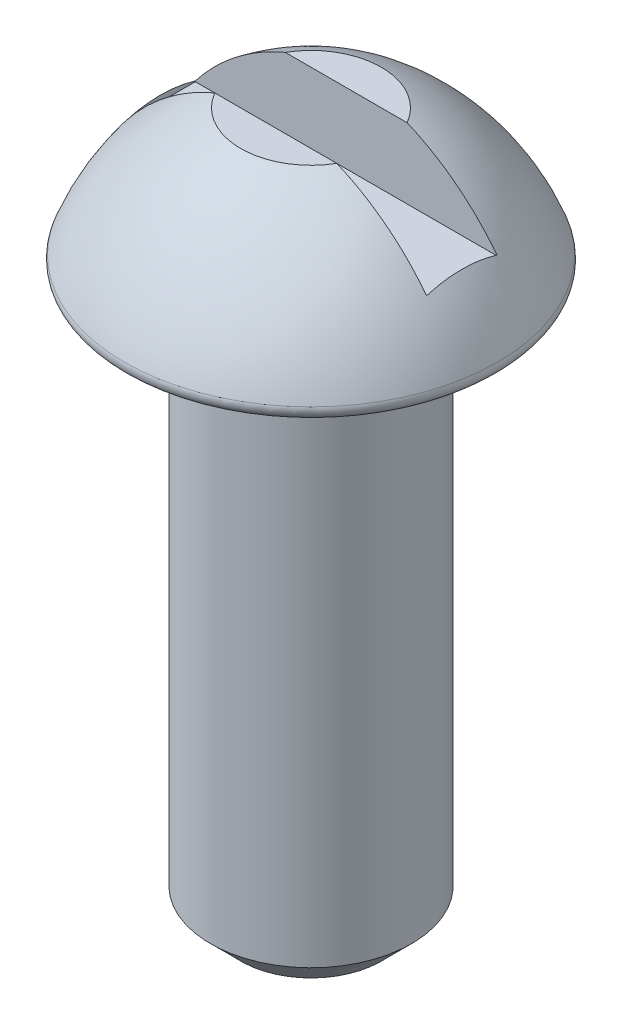
ISO-10303-21;
HEADER;
FILE_DESCRIPTION(('STEP AP214'),'2;1');
FILE_NAME('part.step','',(''),(''),'','','');
FILE_SCHEMA(('AUTOMOTIVE_DESIGN { 1 0 10303 214 1 1 1 1 }'));
ENDSEC;
DATA;
#1=APPLICATION_CONTEXT('core data for automotive mechanical design processes');
#2=APPLICATION_PROTOCOL_DEFINITION('international standard','automotive_design',2000,#1);
#3=PRODUCT_CONTEXT('',#1,'mechanical');
#4=PRODUCT('Part','Part','',(#3));
#5=PRODUCT_RELATED_PRODUCT_CATEGORY('part','',(#4));
#6=PRODUCT_DEFINITION_FORMATION('','',#4);
#7=PRODUCT_DEFINITION_CONTEXT('part definition',#1,'design');
#8=PRODUCT_DEFINITION('design','',#6,#7);
#9=PRODUCT_DEFINITION_SHAPE('','',#8);
#10=(LENGTH_UNIT() NAMED_UNIT(*) SI_UNIT(.MILLI.,.METRE.));
#11=(NAMED_UNIT(*) PLANE_ANGLE_UNIT() SI_UNIT($,.RADIAN.));
#12=(NAMED_UNIT(*) SI_UNIT($,.STERADIAN.) SOLID_ANGLE_UNIT());
#13=UNCERTAINTY_MEASURE_WITH_UNIT(LENGTH_MEASURE(1.E-05),#10,'distance_accuracy_value','');
#14=(GEOMETRIC_REPRESENTATION_CONTEXT(3) GLOBAL_UNCERTAINTY_ASSIGNED_CONTEXT((#13)) GLOBAL_UNIT_ASSIGNED_CONTEXT((#10,
#11,#12)) REPRESENTATION_CONTEXT('',''));
#15=CARTESIAN_POINT('',(0.,0.,0.));
#16=DIRECTION('',(0.,0.,1.));
#17=DIRECTION('',(1.,0.,0.));
#18=AXIS2_PLACEMENT_3D('',#15,#16,#17);
#19=CARTESIAN_POINT('',(0.,7.,0.));
#20=DIRECTION('',(0.,1.,0.));
#21=DIRECTION('',(0.,0.,1.));
#22=AXIS2_PLACEMENT_3D('',#19,#20,#21);
#23=PLANE('',#22);
#24=DIRECTION('',(-1.,0.,0.));
#25=VECTOR('',#24,1.);
#26=CARTESIAN_POINT('',(-1.5,7.,-0.35));
#27=LINE('',#26,#25);
#28=CARTESIAN_POINT('',(0.606217782649106,7.,-0.35));
#29=VERTEX_POINT('',#28);
#30=CARTESIAN_POINT('',(-0.606217782649106,7.,-0.35));
#31=VERTEX_POINT('',#30);
#32=EDGE_CURVE('E105',#29,#31,#27,.T.);
#33=ORIENTED_EDGE('',*,*,#32,.F.);
#34=CARTESIAN_POINT('',(0.,7.,0.));
#35=DIRECTION('',(0.,-1.,0.));
#36=DIRECTION('',(0.,0.,-1.));
#37=AXIS2_PLACEMENT_3D('',#34,#35,#36);
#38=CIRCLE('',#37,0.7);
#39=EDGE_CURVE('E128',#31,#29,#38,.T.);
#40=ORIENTED_EDGE('',*,*,#39,.F.);
#41=EDGE_LOOP('',(#33,#40));
#42=FACE_BOUND('',#41,.T.);
#43=ADVANCED_FACE('F29',(#42),#23,.T.);
#44=CARTESIAN_POINT('',(0.7,0.,0.));
#45=DIRECTION('',(0.,-1.,0.));
#46=DIRECTION('',(0.,0.,-1.));
#47=AXIS2_PLACEMENT_3D('',#44,#45,#46);
#48=PLANE('',#47);
#49=CARTESIAN_POINT('',(0.,0.,0.));
#50=DIRECTION('',(0.,-1.,0.));
#51=DIRECTION('',(0.,0.,-1.));
#52=AXIS2_PLACEMENT_3D('',#49,#50,#51);
#53=CIRCLE('',#52,0.7);
#54=CARTESIAN_POINT('',(0.,0.,-0.7));
#55=VERTEX_POINT('',#54);
#56=EDGE_CURVE('E115',#55,#55,#53,.T.);
#57=ORIENTED_EDGE('',*,*,#56,.T.);
#58=EDGE_LOOP('',(#57));
#59=FACE_BOUND('',#58,.T.);
#60=ADVANCED_FACE('F31',(#59),#48,.T.);
#61=DIRECTION('',(1.,0.,0.));
#62=VECTOR('',#61,1.);
#63=CARTESIAN_POINT('',(-1.5,7.,0.35));
#64=LINE('',#63,#62);
#65=CARTESIAN_POINT('',(-0.606217782649106,7.,0.35));
#66=VERTEX_POINT('',#65);
#67=CARTESIAN_POINT('',(0.606217782649106,7.,0.35));
#68=VERTEX_POINT('',#67);
#69=EDGE_CURVE('E107',#66,#68,#64,.T.);
#70=ORIENTED_EDGE('',*,*,#69,.F.);
#71=EDGE_CURVE('E131',#68,#66,#38,.T.);
#72=ORIENTED_EDGE('',*,*,#71,.F.);
#73=EDGE_LOOP('',(#70,#72));
#74=FACE_BOUND('',#73,.T.);
#75=ADVANCED_FACE('F176',(#74),#23,.T.);
#76=CARTESIAN_POINT('',(0.,4.92256290284434,0.));
#77=DIRECTION('',(0.,-1.,0.));
#78=DIRECTION('',(0.,0.,-1.));
#79=AXIS2_PLACEMENT_3D('',#76,#77,#78);
#80=DEGENERATE_TOROIDAL_SURFACE('',#79,0.30700994668161,2.30863897683338,.F.);
#81=CARTESIAN_POINT('',(0.,7.13573977225981,-0.35));
#82=CARTESIAN_POINT('',(-0.0301024352128601,7.1357409907999,-0.35));
#83=CARTESIAN_POINT('',(-0.0602037065858999,7.13457737456034,-0.35));
#84=CARTESIAN_POINT('',(-0.120237464629894,7.13004476709693,-0.35));
#85=CARTESIAN_POINT('',(-0.150169923687119,7.12667542505043,-0.35));
#86=CARTESIAN_POINT('',(-0.239755636779077,7.11364003954532,-0.35));
#87=CARTESIAN_POINT('',(-0.29898894542948,7.10104982862452,-0.35));
#88=CARTESIAN_POINT('',(-0.4107220201702,7.07124883148929,-0.35));
#89=CARTESIAN_POINT('',(-0.463360105723818,7.0545337272663,-0.35));
#90=CARTESIAN_POINT('',(-0.567078580438325,7.01677768390689,-0.35));
#91=CARTESIAN_POINT('',(-0.618158166080245,6.99573455523669,-0.35));
#92=CARTESIAN_POINT('',(-0.768700695331825,6.92668912362428,-0.35));
#93=CARTESIAN_POINT('',(-0.865504105738005,6.87276045607374,-0.35));
#94=CARTESIAN_POINT('',(-1.05381770511512,6.74855258072186,-0.35));
#95=CARTESIAN_POINT('',(-1.14493451427674,6.67768151341926,-0.35));
#96=CARTESIAN_POINT('',(-1.31520585423532,6.5228692332829,-0.35));
#97=CARTESIAN_POINT('',(-1.39436581290114,6.43893398634478,-0.35));
#98=CARTESIAN_POINT('',(-1.5458587899203,6.25150386434966,-0.35));
#99=CARTESIAN_POINT('',(-1.61683638715699,6.14690960003854,-0.35));
#100=CARTESIAN_POINT('',(-1.74048477136378,5.9273513028306,-0.35));
#101=CARTESIAN_POINT('',(-1.79314587012967,5.81238182250396,-0.35));
#102=CARTESIAN_POINT('',(-1.87917651162118,5.57395439700353,-0.35));
#103=CARTESIAN_POINT('',(-1.91232042380521,5.45041495071043,-0.35));
#104=CARTESIAN_POINT('',(-1.95744743808432,5.19955872286589,-0.35));
#105=CARTESIAN_POINT('',(-1.9694348144659,5.07224270958615,-0.35));
#106=CARTESIAN_POINT('',(-1.97193309925212,4.81708719715164,-0.35));
#107=CARTESIAN_POINT('',(-1.96239143952019,4.6892471791102,-0.35));
#108=CARTESIAN_POINT('',(-1.92197991496443,4.43692504523293,-0.35));
#109=CARTESIAN_POINT('',(-1.89110056432445,4.31244444843431,-0.35));
#110=CARTESIAN_POINT('',(-1.80884392511569,4.07036655976084,-0.35));
#111=CARTESIAN_POINT('',(-1.75745428138543,3.95277346588935,-0.35));
#112=CARTESIAN_POINT('',(-1.63569213592404,3.72806771696485,-0.35));
#113=CARTESIAN_POINT('',(-1.56534615403697,3.62094070305138,-0.35));
#114=CARTESIAN_POINT('',(-1.40788549136369,3.42042796844041,-0.35));
#115=CARTESIAN_POINT('',(-1.32082850128929,3.32699686840395,-0.35));
#116=CARTESIAN_POINT('',(-1.13169955336796,3.15579882780109,-0.35));
#117=CARTESIAN_POINT('',(-1.02956695382156,3.07809830586138,-0.35));
#118=CARTESIAN_POINT('',(-0.867954840857822,2.97596834442508,-0.35));
#119=CARTESIAN_POINT('',(-0.812867875261867,2.94440520962073,-0.35));
#120=CARTESIAN_POINT('',(-0.700072885190367,2.88623855042426,-0.35));
#121=CARTESIAN_POINT('',(-0.642363567822303,2.85963750621013,-0.35));
#122=CARTESIAN_POINT('',(-0.525137072964046,2.81206247407257,-0.35));
#123=CARTESIAN_POINT('',(-0.465635245674405,2.79105066689571,-0.35));
#124=CARTESIAN_POINT('',(-0.344796976922579,2.75519828705325,-0.35));
#125=CARTESIAN_POINT('',(-0.283462170275168,2.74035238137611,-0.35));
#126=CARTESIAN_POINT('',(-0.182837497701831,2.72267504478291,-0.35));
#127=CARTESIAN_POINT('',(-0.143975000741483,2.71742349587871,-0.35));
#128=CARTESIAN_POINT('',(-0.0659472153998688,2.71060851468356,-0.35));
#129=CARTESIAN_POINT('',(-0.0267822634587777,2.709041449989,-0.35));
#130=CARTESIAN_POINT('',(0.0514996994513468,2.70986014915738,-0.35));
#131=CARTESIAN_POINT('',(0.0906167147447711,2.71224552543082,-0.35));
#132=CARTESIAN_POINT('',(0.168489516968755,2.72057120365083,-0.35));
#133=CARTESIAN_POINT('',(0.207244913460364,2.72651497794714,-0.35));
#134=CARTESIAN_POINT('',(0.297186983275777,2.74385667146756,-0.35));
#135=CARTESIAN_POINT('',(0.348147444927707,2.75641909406697,-0.35));
#136=CARTESIAN_POINT('',(0.448782130756164,2.78585305100436,-0.35));
#137=CARTESIAN_POINT('',(0.498456106193271,2.80272541190968,-0.35));
#138=CARTESIAN_POINT('',(0.645691735122621,2.85920364103099,-0.35));
#139=CARTESIAN_POINT('',(0.741086931735451,2.90458897505198,-0.35));
#140=CARTESIAN_POINT('',(0.926914711477642,3.01006939168425,-0.35));
#141=CARTESIAN_POINT('',(1.01712639940075,3.07054913552739,-0.35));
#142=CARTESIAN_POINT('',(1.18761541773933,3.20377154084975,-0.35));
#143=CARTESIAN_POINT('',(1.26791683452433,3.27648341302051,-0.35));
#144=CARTESIAN_POINT('',(1.42898606712891,3.44492874445312,-0.35));
#145=CARTESIAN_POINT('',(1.50785880157877,3.54248421849531,-0.35));
#146=CARTESIAN_POINT('',(1.64853351430612,3.74939447232945,-0.35));
#147=CARTESIAN_POINT('',(1.71031058090735,3.85876615151073,-0.35));
#148=CARTESIAN_POINT('',(1.81587916059814,4.08809092488977,-0.35));
#149=CARTESIAN_POINT('',(1.85935475794216,4.20818964733825,-0.35));
#150=CARTESIAN_POINT('',(1.92559076522618,4.4539162328496,-0.35));
#151=CARTESIAN_POINT('',(1.94835898429007,4.57954199281432,-0.35));
#152=CARTESIAN_POINT('',(1.97262656380435,4.83332204735555,-0.35));
#153=CARTESIAN_POINT('',(1.97404368969975,4.96148421557371,-0.35));
#154=CARTESIAN_POINT('',(1.95535530532741,5.21625193900725,-0.35));
#155=CARTESIAN_POINT('',(1.9352459718645,5.34285721367134,-0.35));
#156=CARTESIAN_POINT('',(1.8740414996424,5.59097434174327,-0.35));
#157=CARTESIAN_POINT('',(1.83293334362505,5.71248298510889,-0.35));
#158=CARTESIAN_POINT('',(1.73088669666713,5.94683264971115,-0.35));
#159=CARTESIAN_POINT('',(1.66995287582174,6.0596757044672,-0.35));
#160=CARTESIAN_POINT('',(1.53005046998841,6.27333261748544,-0.35));
#161=CARTESIAN_POINT('',(1.45110918047703,6.37416433381029,-0.35));
#162=CARTESIAN_POINT('',(1.27729409761747,6.56109854555075,-0.35));
#163=CARTESIAN_POINT('',(1.18241077455344,6.64719216841669,-0.35));
#164=CARTESIAN_POINT('',(0.979876940738833,6.80150053722627,-0.35));
#165=CARTESIAN_POINT('',(0.872308436433896,6.86982186068413,-0.35));
#166=CARTESIAN_POINT('',(0.703337919829298,6.95732153569163,-0.35));
#167=CARTESIAN_POINT('',(0.645714301815414,6.98400055571077,-0.35));
#168=CARTESIAN_POINT('',(0.528241861947786,7.03192416058878,-0.35));
#169=CARTESIAN_POINT('',(0.468394366795807,7.05317192780429,-0.35));
#170=CARTESIAN_POINT('',(0.374465982094127,7.0811684898228,-0.35));
#171=CARTESIAN_POINT('',(0.341030799034512,7.09011893346942,-0.35));
#172=CARTESIAN_POINT('',(0.273662343838694,7.10591092919828,-0.35));
#173=CARTESIAN_POINT('',(0.239729147195218,7.11275279752508,-0.35));
#174=CARTESIAN_POINT('',(0.171615827365619,7.12395218909176,-0.35));
#175=CARTESIAN_POINT('',(0.137437694740271,7.12832157851761,-0.35));
#176=CARTESIAN_POINT('',(0.0688391385061037,7.13421415114043,-0.35));
#177=CARTESIAN_POINT('',(0.0344188084861329,7.13573837899386,-0.35));
#178=CARTESIAN_POINT('',(0.,7.13573977225981,-0.35));
#179=B_SPLINE_CURVE_WITH_KNOTS('',3,(#81,#82,#83,#84,#85,#86,#87,#88,#89,#90,#91,#92,#93,#94,
#95,#96,#97,#98,#99,#100,#101,#102,#103,#104,#105,#106,#107,#108,#109,#110,#111,#112,#113,#114,
#115,#116,#117,#118,#119,#120,#121,#122,#123,#124,#125,#126,#127,#128,#129,#130,#131,#132,#133,
#134,#135,#136,#137,#138,#139,#140,#141,#142,#143,#144,#145,#146,#147,#148,#149,#150,#151,#152,
#153,#154,#155,#156,#157,#158,#159,#160,#161,#162,#163,#164,#165,#166,#167,#168,#169,#170,#171,
#172,#173,#174,#175,#176,#177,#178),.UNSPECIFIED.,.T.,.F.,(4,2,2,2,2,2,2,2,2,2,2,2,2,2,2,2,2,2,
2,2,2,2,2,2,2,2,2,2,2,2,2,2,2,2,2,2,2,2,2,2,2,2,2,2,2,2,2,2,4),(0.,0.0902833208739151,
0.180581004879809,0.361796063276473,0.527288087985619,0.692864041427401,1.02390289255828,
1.36885285309954,1.71364574828677,2.0910746667025,2.46870291729688,2.85061517384456,
3.23245026325271,3.61521870029255,3.99815740922052,4.38132714497276,4.76396358598733,
5.145302081863,5.52821856826565,5.71848612033824,5.90884851959201,6.09788804105489,
6.28676371623324,6.40427084256284,6.5216620740792,6.63904179450269,6.75653624332486,
6.91374732931968,7.07098858819111,7.38662454837917,7.71131599850878,8.0352020769111,
8.40979352951631,8.78492799356518,9.16629591030332,9.54751994664993,9.93021190828653,
10.3129718490002,10.6959693526722,11.0788767034316,11.4612074604209,11.8437675828505,
12.2239777193922,12.4142717245481,12.6044539730276,12.708238810703,12.812008075123,
12.9152750005792,13.0185040021094),.UNSPECIFIED.);
#180=CARTESIAN_POINT('',(1.5,6.30722487525319,-0.35));
#181=VERTEX_POINT('',#180);
#182=EDGE_CURVE('E11',#181,#29,#179,.T.);
#183=ORIENTED_EDGE('',*,*,#182,.F.);
#184=CARTESIAN_POINT('',(1.5,6.35940979028503,0.));
#185=CARTESIAN_POINT('',(1.5,6.35940117527301,-0.0789068754106214));
#186=CARTESIAN_POINT('',(1.5,6.35151559324378,-0.157939355680734));
#187=CARTESIAN_POINT('',(1.5,6.3204761977011,-0.313038755257547));
#188=CARTESIAN_POINT('',(1.5,6.29728887849217,-0.389098777871058));
#189=CARTESIAN_POINT('',(1.5,6.24126859806856,-0.525400075486103));
#190=CARTESIAN_POINT('',(1.5,6.21020176452969,-0.586377951264508));
#191=CARTESIAN_POINT('',(1.5,6.13903627072882,-0.702733899656246));
#192=CARTESIAN_POINT('',(1.5,6.09894355200281,-0.758115621500189));
#193=CARTESIAN_POINT('',(1.5,6.00741215615635,-0.866522430703714));
#194=CARTESIAN_POINT('',(1.5,5.95531744432904,-0.918993130106391));
#195=CARTESIAN_POINT('',(1.5,5.84363554439566,-1.01525351273952));
#196=CARTESIAN_POINT('',(1.5,5.78404453276471,-1.0590387363215));
#197=CARTESIAN_POINT('',(1.5,5.65390214417337,-1.14030196999279));
#198=CARTESIAN_POINT('',(1.5,5.5828543819259,-1.17698613895365));
#199=CARTESIAN_POINT('',(1.5,5.43583340388057,-1.23859568647142));
#200=CARTESIAN_POINT('',(1.5,5.35985891849232,-1.26351802025982));
#201=CARTESIAN_POINT('',(1.5,5.20081830526798,-1.30213580286138));
#202=CARTESIAN_POINT('',(1.5,5.11758981678659,-1.31516501550607));
#203=CARTESIAN_POINT('',(1.5,4.95011896880228,-1.3273951363592));
#204=CARTESIAN_POINT('',(1.5,4.86587645289109,-1.32659388325657));
#205=CARTESIAN_POINT('',(1.5,4.69682801634196,-1.31100598337756));
#206=CARTESIAN_POINT('',(1.5,4.61204997514758,-1.29591427001923));
#207=CARTESIAN_POINT('',(1.5,4.44625150305734,-1.25161746552035));
#208=CARTESIAN_POINT('',(1.5,4.36523125169323,-1.22241170082807));
#209=CARTESIAN_POINT('',(1.5,4.20995516153703,-1.150774844073));
#210=CARTESIAN_POINT('',(1.5,4.13565492875653,-1.10844022107787));
#211=CARTESIAN_POINT('',(1.5,3.99558375099919,-1.01140940009124));
#212=CARTESIAN_POINT('',(1.5,3.92981224200647,-0.956714020189879));
#213=CARTESIAN_POINT('',(1.5,3.81167933387313,-0.838692716318822));
#214=CARTESIAN_POINT('',(1.5,3.75888683590651,-0.775799413158824));
#215=CARTESIAN_POINT('',(1.5,3.66566156087609,-0.641422049268792));
#216=CARTESIAN_POINT('',(1.5,3.62522165984964,-0.569942973374794));
#217=CARTESIAN_POINT('',(1.5,3.56138813678362,-0.426353683253212));
#218=CARTESIAN_POINT('',(1.5,3.53691319574604,-0.354725107969685));
#219=CARTESIAN_POINT('',(1.5,3.50162295621348,-0.208191871208454));
#220=CARTESIAN_POINT('',(1.5,3.49079712574264,-0.133289781886585));
#221=CARTESIAN_POINT('',(1.5,3.48377588161359,0.0107388735101602));
#222=CARTESIAN_POINT('',(1.5,3.48640653657512,0.0798104971340136));
#223=CARTESIAN_POINT('',(1.5,3.50347672130369,0.216470996634306));
#224=CARTESIAN_POINT('',(1.5,3.51791568636424,0.284059943257802));
#225=CARTESIAN_POINT('',(1.5,3.55749241124266,0.414640873488695));
#226=CARTESIAN_POINT('',(1.5,3.58242841962748,0.477694559269938));
#227=CARTESIAN_POINT('',(1.5,3.64190646463359,0.599082826856922));
#228=CARTESIAN_POINT('',(1.5,3.67645064857673,0.657416349991642));
#229=CARTESIAN_POINT('',(1.5,3.75641623215448,0.77173089633452));
#230=CARTESIAN_POINT('',(1.5,3.80239121683484,0.827324040488963));
#231=CARTESIAN_POINT('',(1.5,3.90235044439788,0.930760533294298));
#232=CARTESIAN_POINT('',(1.5,3.95633736099184,0.978601283653914));
#233=CARTESIAN_POINT('',(1.5,4.07570828307641,1.06939508415863));
#234=CARTESIAN_POINT('',(1.5,4.1416707645988,1.11158832366889));
#235=CARTESIAN_POINT('',(1.5,4.2794148818912,1.18506079377902));
#236=CARTESIAN_POINT('',(1.5,4.35119826886297,1.21633672481574));
#237=CARTESIAN_POINT('',(1.5,4.50335258097234,1.26899663114905));
#238=CARTESIAN_POINT('',(1.5,4.58397986859716,1.28964184313034));
#239=CARTESIAN_POINT('',(1.5,4.74752120906563,1.31755133411356));
#240=CARTESIAN_POINT('',(1.5,4.83043571747581,1.32481292755937));
#241=CARTESIAN_POINT('',(1.5,4.99890222534467,1.32582180677956));
#242=CARTESIAN_POINT('',(1.5,5.08445709214886,1.31914760109606));
#243=CARTESIAN_POINT('',(1.5,5.25324879008596,1.29156086022552));
#244=CARTESIAN_POINT('',(1.5,5.33648545543133,1.27064730941109));
#245=CARTESIAN_POINT('',(1.5,5.49834081092673,1.21498289879362));
#246=CARTESIAN_POINT('',(1.5,5.57695284160498,1.18021261924573));
#247=CARTESIAN_POINT('',(1.5,5.72699340046092,1.0975858409938));
#248=CARTESIAN_POINT('',(1.5,5.79842236951516,1.04973014610787));
#249=CARTESIAN_POINT('',(1.5,5.92964162807823,0.943642515170848));
#250=CARTESIAN_POINT('',(1.5,5.98971467396328,0.885761135218327));
#251=CARTESIAN_POINT('',(1.5,6.09847802946066,0.760072949089756));
#252=CARTESIAN_POINT('',(1.5,6.14716843039645,0.692266222552295));
#253=CARTESIAN_POINT('',(1.5,6.22805682860814,0.553432250655612));
#254=CARTESIAN_POINT('',(1.5,6.26113591718345,0.482918622067334));
#255=CARTESIAN_POINT('',(1.5,6.31356700227299,0.337071846172543));
#256=CARTESIAN_POINT('',(1.5,6.33295711764867,0.261752724145795));
#257=CARTESIAN_POINT('',(1.5,6.34974942894623,0.154725705431187));
#258=CARTESIAN_POINT('',(1.5,6.35336569440759,0.123900430957695));
#259=CARTESIAN_POINT('',(1.5,6.3581978100163,0.0620566073563594));
#260=CARTESIAN_POINT('',(1.5,6.35941317900015,0.031038020736103));
#261=CARTESIAN_POINT('',(1.5,6.35940979028503,0.));
#262=B_SPLINE_CURVE_WITH_KNOTS('',3,(#184,#185,#186,#187,#188,#189,#190,#191,#192,#193,#194,
#195,#196,#197,#198,#199,#200,#201,#202,#203,#204,#205,#206,#207,#208,#209,#210,#211,#212,#213,
#214,#215,#216,#217,#218,#219,#220,#221,#222,#223,#224,#225,#226,#227,#228,#229,#230,#231,#232,
#233,#234,#235,#236,#237,#238,#239,#240,#241,#242,#243,#244,#245,#246,#247,#248,#249,#250,#251,
#252,#253,#254,#255,#256,#257,#258,#259,#260,#261),.UNSPECIFIED.,.T.,.F.,(4,2,2,2,2,2,2,2,2,2,2,
2,2,2,2,2,2,2,2,2,2,2,2,2,2,2,2,2,2,2,2,2,2,2,2,2,2,2,4),(0.,0.236563815135407,
0.473647352479771,0.678110204009467,0.882438853798619,1.10332066880809,1.3243156059889,
1.56313984676287,1.80202587774178,2.05359361128751,2.30520065811888,2.56230294299699,
2.81941749853965,3.07468586624047,3.32993734408485,3.57498099157581,3.81988305004127,
4.0457341253292,4.27141082172621,4.47775382877255,4.68408696849498,4.88662348376049,
5.08920530013657,5.30471899964984,5.52030478197371,5.75419393440536,5.98815371461099,
6.2367079092848,6.48531197340128,6.74154387684006,6.99779405804366,7.25440463544737,
7.51099945317496,7.7599701301713,8.0089388095964,8.24135933298585,8.47313006846189,
8.56616380602812,8.65921618658907),.UNSPECIFIED.);
#263=CARTESIAN_POINT('',(1.5,6.30722487526863,0.35));
#264=VERTEX_POINT('',#263);
#265=EDGE_CURVE('E33',#264,#181,#262,.T.);
#266=ORIENTED_EDGE('',*,*,#265,.F.);
#267=CARTESIAN_POINT('',(0.,7.13573977225981,0.35));
#268=CARTESIAN_POINT('',(0.0301024352128601,7.1357409907999,0.35));
#269=CARTESIAN_POINT('',(0.0602037065858999,7.13457737456034,0.35));
#270=CARTESIAN_POINT('',(0.120237464629894,7.13004476709693,0.35));
#271=CARTESIAN_POINT('',(0.150169923687119,7.12667542505043,0.35));
#272=CARTESIAN_POINT('',(0.239755636779077,7.11364003954532,0.35));
#273=CARTESIAN_POINT('',(0.29898894542948,7.10104982862452,0.35));
#274=CARTESIAN_POINT('',(0.4107220201702,7.07124883148929,0.35));
#275=CARTESIAN_POINT('',(0.463360105723818,7.0545337272663,0.35));
#276=CARTESIAN_POINT('',(0.567078580438325,7.01677768390689,0.35));
#277=CARTESIAN_POINT('',(0.618158166080245,6.99573455523669,0.35));
#278=CARTESIAN_POINT('',(0.768700695331825,6.92668912362428,0.35));
#279=CARTESIAN_POINT('',(0.865504105738005,6.87276045607374,0.35));
#280=CARTESIAN_POINT('',(1.05381770511512,6.74855258072186,0.35));
#281=CARTESIAN_POINT('',(1.14493451427674,6.67768151341926,0.35));
#282=CARTESIAN_POINT('',(1.31520585423532,6.5228692332829,0.35));
#283=CARTESIAN_POINT('',(1.39436581290114,6.43893398634478,0.35));
#284=CARTESIAN_POINT('',(1.5458587899203,6.25150386434966,0.35));
#285=CARTESIAN_POINT('',(1.61683638715699,6.14690960003854,0.35));
#286=CARTESIAN_POINT('',(1.74048477136378,5.9273513028306,0.35));
#287=CARTESIAN_POINT('',(1.79314587012967,5.81238182250396,0.35));
#288=CARTESIAN_POINT('',(1.87917651162118,5.57395439700353,0.35));
#289=CARTESIAN_POINT('',(1.91232042380521,5.45041495071043,0.35));
#290=CARTESIAN_POINT('',(1.95744743808432,5.19955872286589,0.35));
#291=CARTESIAN_POINT('',(1.9694348144659,5.07224270958615,0.35));
#292=CARTESIAN_POINT('',(1.97193309925212,4.81708719715164,0.35));
#293=CARTESIAN_POINT('',(1.96239143952019,4.6892471791102,0.35));
#294=CARTESIAN_POINT('',(1.92197991496443,4.43692504523293,0.35));
#295=CARTESIAN_POINT('',(1.89110056432445,4.31244444843431,0.35));
#296=CARTESIAN_POINT('',(1.80884392511569,4.07036655976084,0.35));
#297=CARTESIAN_POINT('',(1.75745428138543,3.95277346588935,0.35));
#298=CARTESIAN_POINT('',(1.63569213592404,3.72806771696485,0.35));
#299=CARTESIAN_POINT('',(1.56534615403697,3.62094070305138,0.35));
#300=CARTESIAN_POINT('',(1.40788549136369,3.42042796844041,0.35));
#301=CARTESIAN_POINT('',(1.32082850128929,3.32699686840395,0.35));
#302=CARTESIAN_POINT('',(1.13169955336796,3.15579882780109,0.35));
#303=CARTESIAN_POINT('',(1.02956695382157,3.07809830586138,0.35));
#304=CARTESIAN_POINT('',(0.867954840857823,2.97596834442508,0.35));
#305=CARTESIAN_POINT('',(0.812867875261868,2.94440520962073,0.35));
#306=CARTESIAN_POINT('',(0.700072885190368,2.88623855042426,0.35));
#307=CARTESIAN_POINT('',(0.642363567822304,2.85963750621013,0.35));
#308=CARTESIAN_POINT('',(0.525137072964047,2.81206247407257,0.35));
#309=CARTESIAN_POINT('',(0.465635245674406,2.79105066689571,0.35));
#310=CARTESIAN_POINT('',(0.34479697692258,2.75519828705325,0.35));
#311=CARTESIAN_POINT('',(0.283462170275169,2.74035238137611,0.35));
#312=CARTESIAN_POINT('',(0.182837497701832,2.72267504478291,0.35));
#313=CARTESIAN_POINT('',(0.143975000741484,2.71742349587871,0.35));
#314=CARTESIAN_POINT('',(0.0659472153998701,2.71060851468356,0.35));
#315=CARTESIAN_POINT('',(0.026782263458779,2.709041449989,0.35));
#316=CARTESIAN_POINT('',(-0.0514996994513456,2.70986014915738,0.35));
#317=CARTESIAN_POINT('',(-0.0906167147447702,2.71224552543082,0.35));
#318=CARTESIAN_POINT('',(-0.168489516968754,2.72057120365083,0.35));
#319=CARTESIAN_POINT('',(-0.207244913460363,2.72651497794714,0.35));
#320=CARTESIAN_POINT('',(-0.297186983275776,2.74385667146756,0.35));
#321=CARTESIAN_POINT('',(-0.348147444927705,2.75641909406697,0.35));
#322=CARTESIAN_POINT('',(-0.448782130756162,2.78585305100436,0.35));
#323=CARTESIAN_POINT('',(-0.498456106193269,2.80272541190968,0.35));
#324=CARTESIAN_POINT('',(-0.645691735122619,2.85920364103099,0.35));
#325=CARTESIAN_POINT('',(-0.741086931735449,2.90458897505198,0.35));
#326=CARTESIAN_POINT('',(-0.92691471147764,3.01006939168425,0.35));
#327=CARTESIAN_POINT('',(-1.01712639940075,3.07054913552739,0.35));
#328=CARTESIAN_POINT('',(-1.18761541773933,3.20377154084975,0.35));
#329=CARTESIAN_POINT('',(-1.26791683452433,3.2764834130205,0.35));
#330=CARTESIAN_POINT('',(-1.42898606712891,3.44492874445312,0.35));
#331=CARTESIAN_POINT('',(-1.50785880157877,3.54248421849531,0.35));
#332=CARTESIAN_POINT('',(-1.64853351430612,3.74939447232944,0.35));
#333=CARTESIAN_POINT('',(-1.71031058090735,3.85876615151072,0.35));
#334=CARTESIAN_POINT('',(-1.81587916059814,4.08809092488976,0.35));
#335=CARTESIAN_POINT('',(-1.85935475794216,4.20818964733824,0.35));
#336=CARTESIAN_POINT('',(-1.92559076522617,4.4539162328496,0.35));
#337=CARTESIAN_POINT('',(-1.94835898429007,4.57954199281432,0.35));
#338=CARTESIAN_POINT('',(-1.97262656380435,4.83332204735554,0.35));
#339=CARTESIAN_POINT('',(-1.97404368969975,4.96148421557371,0.35));
#340=CARTESIAN_POINT('',(-1.95535530532741,5.21625193900725,0.35));
#341=CARTESIAN_POINT('',(-1.9352459718645,5.34285721367133,0.35));
#342=CARTESIAN_POINT('',(-1.8740414996424,5.59097434174327,0.35));
#343=CARTESIAN_POINT('',(-1.83293334362505,5.71248298510889,0.35));
#344=CARTESIAN_POINT('',(-1.73088669666713,5.94683264971114,0.35));
#345=CARTESIAN_POINT('',(-1.66995287582174,6.05967570446719,0.35));
#346=CARTESIAN_POINT('',(-1.53005046998842,6.27333261748544,0.35));
#347=CARTESIAN_POINT('',(-1.45110918047703,6.37416433381029,0.35));
#348=CARTESIAN_POINT('',(-1.27729409761748,6.56109854555075,0.35));
#349=CARTESIAN_POINT('',(-1.18241077455345,6.64719216841669,0.35));
#350=CARTESIAN_POINT('',(-0.979876940738836,6.80150053722627,0.35));
#351=CARTESIAN_POINT('',(-0.872308436433899,6.86982186068413,0.35));
#352=CARTESIAN_POINT('',(-0.703337919829301,6.95732153569163,0.35));
#353=CARTESIAN_POINT('',(-0.645714301815416,6.98400055571077,0.35));
#354=CARTESIAN_POINT('',(-0.528241861947787,7.03192416058878,0.35));
#355=CARTESIAN_POINT('',(-0.468394366795808,7.05317192780429,0.35));
#356=CARTESIAN_POINT('',(-0.374465982094129,7.0811684898228,0.35));
#357=CARTESIAN_POINT('',(-0.341030799034513,7.09011893346942,0.35));
#358=CARTESIAN_POINT('',(-0.273662343838695,7.10591092919828,0.35));
#359=CARTESIAN_POINT('',(-0.239729147195219,7.11275279752508,0.35));
#360=CARTESIAN_POINT('',(-0.171615827365621,7.12395218909175,0.35));
#361=CARTESIAN_POINT('',(-0.137437694740273,7.12832157851761,0.35));
#362=CARTESIAN_POINT('',(-0.068839138506105,7.13421415114044,0.35));
#363=CARTESIAN_POINT('',(-0.0344188084861336,7.13573837899386,0.35));
#364=CARTESIAN_POINT('',(0.,7.13573977225981,0.35));
#365=B_SPLINE_CURVE_WITH_KNOTS('',3,(#267,#268,#269,#270,#271,#272,#273,#274,#275,#276,#277,
#278,#279,#280,#281,#282,#283,#284,#285,#286,#287,#288,#289,#290,#291,#292,#293,#294,#295,#296,
#297,#298,#299,#300,#301,#302,#303,#304,#305,#306,#307,#308,#309,#310,#311,#312,#313,#314,#315,
#316,#317,#318,#319,#320,#321,#322,#323,#324,#325,#326,#327,#328,#329,#330,#331,#332,#333,#334,
#335,#336,#337,#338,#339,#340,#341,#342,#343,#344,#345,#346,#347,#348,#349,#350,#351,#352,#353,
#354,#355,#356,#357,#358,#359,#360,#361,#362,#363,#364),.UNSPECIFIED.,.T.,.F.,(4,2,2,2,2,2,2,2,
2,2,2,2,2,2,2,2,2,2,2,2,2,2,2,2,2,2,2,2,2,2,2,2,2,2,2,2,2,2,2,2,2,2,2,2,2,2,2,2,4),(0.,
0.0902833208739151,0.180581004879809,0.361796063276473,0.527288087985619,0.692864041427401,
1.02390289255828,1.36885285309954,1.71364574828677,2.0910746667025,2.46870291729688,
2.85061517384456,3.23245026325271,3.61521870029255,3.99815740922052,4.38132714497276,
4.76396358598733,5.145302081863,5.52821856826565,5.71848612033824,5.90884851959201,
6.09788804105489,6.28676371623324,6.40427084256284,6.5216620740792,6.63904179450269,
6.75653624332486,6.91374732931968,7.07098858819111,7.38662454837917,7.71131599850878,
8.0352020769111,8.4097935295163,8.78492799356517,9.16629591030331,9.54751994664992,
9.93021190828653,10.3129718490002,10.6959693526722,11.0788767034316,11.4612074604209,
11.8437675828505,12.2239777193922,12.4142717245481,12.6044539730276,12.708238810703,
12.812008075123,12.9152750005792,13.0185040021094),.UNSPECIFIED.);
#366=EDGE_CURVE('E143',#68,#264,#365,.T.);
#367=ORIENTED_EDGE('',*,*,#366,.F.);
#368=ORIENTED_EDGE('',*,*,#71,.T.);
#369=CARTESIAN_POINT('',(-1.50000000000003,6.30722487525308,0.35));
#370=VERTEX_POINT('',#369);
#371=EDGE_CURVE('E138',#370,#66,#365,.T.);
#372=ORIENTED_EDGE('',*,*,#371,.F.);
#373=CARTESIAN_POINT('',(-1.5,6.35940979028503,0.));
#374=CARTESIAN_POINT('',(-1.5,6.35940117527301,0.0789068754106214));
#375=CARTESIAN_POINT('',(-1.5,6.35151559324378,0.157939355680735));
#376=CARTESIAN_POINT('',(-1.5,6.3204761977011,0.313038755257547));
#377=CARTESIAN_POINT('',(-1.5,6.29728887849217,0.389098777871058));
#378=CARTESIAN_POINT('',(-1.5,6.24126859806856,0.525400075486102));
#379=CARTESIAN_POINT('',(-1.5,6.21020176452969,0.586377951264508));
#380=CARTESIAN_POINT('',(-1.5,6.13903627072882,0.702733899656246));
#381=CARTESIAN_POINT('',(-1.5,6.09894355200281,0.758115621500189));
#382=CARTESIAN_POINT('',(-1.5,6.00741215615635,0.866522430703714));
#383=CARTESIAN_POINT('',(-1.5,5.95531744432904,0.918993130106391));
#384=CARTESIAN_POINT('',(-1.5,5.84363554439566,1.01525351273952));
#385=CARTESIAN_POINT('',(-1.5,5.78404453276471,1.0590387363215));
#386=CARTESIAN_POINT('',(-1.5,5.65390214417337,1.14030196999279));
#387=CARTESIAN_POINT('',(-1.5,5.5828543819259,1.17698613895364));
#388=CARTESIAN_POINT('',(-1.5,5.43583340388057,1.23859568647142));
#389=CARTESIAN_POINT('',(-1.5,5.35985891849232,1.26351802025982));
#390=CARTESIAN_POINT('',(-1.5,5.20081830526798,1.30213580286138));
#391=CARTESIAN_POINT('',(-1.5,5.11758981678659,1.31516501550607));
#392=CARTESIAN_POINT('',(-1.5,4.95011896880228,1.3273951363592));
#393=CARTESIAN_POINT('',(-1.5,4.86587645289109,1.32659388325657));
#394=CARTESIAN_POINT('',(-1.5,4.69682801634196,1.31100598337756));
#395=CARTESIAN_POINT('',(-1.5,4.61204997514758,1.29591427001923));
#396=CARTESIAN_POINT('',(-1.5,4.44625150305734,1.25161746552035));
#397=CARTESIAN_POINT('',(-1.5,4.36523125169323,1.22241170082807));
#398=CARTESIAN_POINT('',(-1.5,4.20995516153703,1.150774844073));
#399=CARTESIAN_POINT('',(-1.5,4.13565492875653,1.10844022107787));
#400=CARTESIAN_POINT('',(-1.5,3.99558375099919,1.01140940009124));
#401=CARTESIAN_POINT('',(-1.5,3.92981224200647,0.956714020189879));
#402=CARTESIAN_POINT('',(-1.5,3.81167933387313,0.838692716318822));
#403=CARTESIAN_POINT('',(-1.5,3.75888683590651,0.775799413158825));
#404=CARTESIAN_POINT('',(-1.5,3.66566156087609,0.641422049268793));
#405=CARTESIAN_POINT('',(-1.5,3.62522165984964,0.569942973374794));
#406=CARTESIAN_POINT('',(-1.5,3.56138813678362,0.426353683253212));
#407=CARTESIAN_POINT('',(-1.5,3.53691319574604,0.354725107969685));
#408=CARTESIAN_POINT('',(-1.5,3.50162295621348,0.208191871208455));
#409=CARTESIAN_POINT('',(-1.5,3.49079712574264,0.133289781886585));
#410=CARTESIAN_POINT('',(-1.5,3.48377588161359,-0.01073887351016));
#411=CARTESIAN_POINT('',(-1.5,3.48640653657512,-0.0798104971340135));
#412=CARTESIAN_POINT('',(-1.5,3.50347672130369,-0.216470996634306));
#413=CARTESIAN_POINT('',(-1.5,3.51791568636424,-0.284059943257802));
#414=CARTESIAN_POINT('',(-1.5,3.55749241124266,-0.414640873488695));
#415=CARTESIAN_POINT('',(-1.5,3.58242841962748,-0.477694559269938));
#416=CARTESIAN_POINT('',(-1.5,3.64190646463359,-0.599082826856922));
#417=CARTESIAN_POINT('',(-1.5,3.67645064857673,-0.657416349991642));
#418=CARTESIAN_POINT('',(-1.5,3.75641623215448,-0.771730896334519));
#419=CARTESIAN_POINT('',(-1.5,3.80239121683484,-0.827324040488962));
#420=CARTESIAN_POINT('',(-1.5,3.90235044439788,-0.930760533294298));
#421=CARTESIAN_POINT('',(-1.5,3.95633736099184,-0.978601283653913));
#422=CARTESIAN_POINT('',(-1.5,4.07570828307641,-1.06939508415863));
#423=CARTESIAN_POINT('',(-1.5,4.14167076459879,-1.11158832366889));
#424=CARTESIAN_POINT('',(-1.5,4.2794148818912,-1.18506079377902));
#425=CARTESIAN_POINT('',(-1.5,4.35119826886297,-1.21633672481574));
#426=CARTESIAN_POINT('',(-1.5,4.50335258097234,-1.26899663114905));
#427=CARTESIAN_POINT('',(-1.5,4.58397986859716,-1.28964184313034));
#428=CARTESIAN_POINT('',(-1.5,4.74752120906563,-1.31755133411356));
#429=CARTESIAN_POINT('',(-1.5,4.83043571747581,-1.32481292755937));
#430=CARTESIAN_POINT('',(-1.5,4.99890222534467,-1.32582180677956));
#431=CARTESIAN_POINT('',(-1.5,5.08445709214886,-1.31914760109606));
#432=CARTESIAN_POINT('',(-1.5,5.25324879008596,-1.29156086022552));
#433=CARTESIAN_POINT('',(-1.5,5.33648545543133,-1.27064730941109));
#434=CARTESIAN_POINT('',(-1.5,5.49834081092672,-1.21498289879362));
#435=CARTESIAN_POINT('',(-1.5,5.57695284160498,-1.18021261924573));
#436=CARTESIAN_POINT('',(-1.5,5.72699340046092,-1.0975858409938));
#437=CARTESIAN_POINT('',(-1.5,5.79842236951516,-1.04973014610787));
#438=CARTESIAN_POINT('',(-1.5,5.92964162807823,-0.943642515170849));
#439=CARTESIAN_POINT('',(-1.5,5.98971467396328,-0.885761135218328));
#440=CARTESIAN_POINT('',(-1.5,6.09847802946066,-0.760072949089757));
#441=CARTESIAN_POINT('',(-1.5,6.14716843039645,-0.692266222552296));
#442=CARTESIAN_POINT('',(-1.5,6.22805682860814,-0.553432250655614));
#443=CARTESIAN_POINT('',(-1.5,6.26113591718345,-0.482918622067335));
#444=CARTESIAN_POINT('',(-1.5,6.31356700227299,-0.337071846172544));
#445=CARTESIAN_POINT('',(-1.5,6.33295711764867,-0.261752724145796));
#446=CARTESIAN_POINT('',(-1.5,6.34974942894623,-0.154725705431187));
#447=CARTESIAN_POINT('',(-1.5,6.35336569440759,-0.123900430957695));
#448=CARTESIAN_POINT('',(-1.5,6.3581978100163,-0.0620566073563591));
#449=CARTESIAN_POINT('',(-1.5,6.35941317900015,-0.0310380207361028));
#450=CARTESIAN_POINT('',(-1.5,6.35940979028503,0.));
#451=B_SPLINE_CURVE_WITH_KNOTS('',3,(#373,#374,#375,#376,#377,#378,#379,#380,#381,#382,#383,
#384,#385,#386,#387,#388,#389,#390,#391,#392,#393,#394,#395,#396,#397,#398,#399,#400,#401,#402,
#403,#404,#405,#406,#407,#408,#409,#410,#411,#412,#413,#414,#415,#416,#417,#418,#419,#420,#421,
#422,#423,#424,#425,#426,#427,#428,#429,#430,#431,#432,#433,#434,#435,#436,#437,#438,#439,#440,
#441,#442,#443,#444,#445,#446,#447,#448,#449,#450),.UNSPECIFIED.,.T.,.F.,(4,2,2,2,2,2,2,2,2,2,2,
2,2,2,2,2,2,2,2,2,2,2,2,2,2,2,2,2,2,2,2,2,2,2,2,2,2,2,4),(0.,0.236563815135407,
0.473647352479771,0.678110204009467,0.882438853798619,1.10332066880809,1.3243156059889,
1.56313984676287,1.80202587774178,2.05359361128751,2.30520065811888,2.56230294299699,
2.81941749853965,3.07468586624047,3.32993734408485,3.57498099157581,3.81988305004127,
4.0457341253292,4.27141082172621,4.47775382877255,4.68408696849498,4.88662348376049,
5.08920530013657,5.30471899964984,5.52030478197371,5.75419393440536,5.98815371461099,
6.2367079092848,6.48531197340128,6.74154387684006,6.99779405804365,7.25440463544737,
7.51099945317496,7.7599701301713,8.0089388095964,8.24135933298585,8.47313006846189,
8.56616380602812,8.65921618658907),.UNSPECIFIED.);
#452=CARTESIAN_POINT('',(-1.5,6.30722487526862,-0.35));
#453=VERTEX_POINT('',#452);
#454=EDGE_CURVE('E89',#453,#370,#451,.T.);
#455=ORIENTED_EDGE('',*,*,#454,.F.);
#456=EDGE_CURVE('E42',#31,#453,#179,.T.);
#457=ORIENTED_EDGE('',*,*,#456,.F.);
#458=ORIENTED_EDGE('',*,*,#39,.T.);
#459=EDGE_LOOP('',(#183,#266,#367,#368,#372,#455,#457,#458));
#460=FACE_BOUND('',#459,.T.);
#461=CARTESIAN_POINT('',(0.,5.73519982692103,0.));
#462=DIRECTION('',(0.,-1.,0.));
#463=DIRECTION('',(0.,0.,-1.));
#464=AXIS2_PLACEMENT_3D('',#461,#462,#463);
#465=CIRCLE('',#464,1.85387763831244);
#466=CARTESIAN_POINT('',(0.,5.73519982692103,-1.85387763831244));
#467=VERTEX_POINT('',#466);
#468=EDGE_CURVE('E135',#467,#467,#465,.F.);
#469=ORIENTED_EDGE('',*,*,#468,.T.);
#470=EDGE_LOOP('',(#469));
#471=FACE_BOUND('',#470,.T.);
#472=ADVANCED_FACE('F147',(#460,#471),#80,.F.);
#473=CARTESIAN_POINT('',(1.9,5.6,0.));
#474=DIRECTION('',(0.,-1.,0.));
#475=DIRECTION('',(0.,0.,-1.));
#476=AXIS2_PLACEMENT_3D('',#473,#474,#475);
#477=PLANE('',#476);
#478=CARTESIAN_POINT('',(0.,5.6,0.));
#479=DIRECTION('',(0.,-1.,0.));
#480=DIRECTION('',(0.,0.,-1.));
#481=AXIS2_PLACEMENT_3D('',#478,#479,#480);
#482=CIRCLE('',#481,1.7602775732231);
#483=CARTESIAN_POINT('',(0.,5.6,-1.7602775732231));
#484=VERTEX_POINT('',#483);
#485=EDGE_CURVE('E132',#484,#484,#482,.T.);
#486=ORIENTED_EDGE('',*,*,#485,.T.);
#487=EDGE_LOOP('',(#486));
#488=FACE_BOUND('',#487,.T.);
#489=CARTESIAN_POINT('',(0.,5.6,0.));
#490=DIRECTION('',(0.,-1.,0.));
#491=DIRECTION('',(0.,0.,-1.));
#492=AXIS2_PLACEMENT_3D('',#489,#490,#491);
#493=CIRCLE('',#492,1.);
#494=CARTESIAN_POINT('',(0.,5.6,-1.));
#495=VERTEX_POINT('',#494);
#496=EDGE_CURVE('E125',#495,#495,#493,.T.);
#497=ORIENTED_EDGE('',*,*,#496,.F.);
#498=EDGE_LOOP('',(#497));
#499=FACE_BOUND('',#498,.T.);
#500=ADVANCED_FACE('F169',(#488,#499),#477,.T.);
#501=CARTESIAN_POINT('',(0.,0.,0.));
#502=DIRECTION('',(0.,-1.,0.));
#503=DIRECTION('',(0.,0.,-1.));
#504=AXIS2_PLACEMENT_3D('',#501,#502,#503);
#505=CYLINDRICAL_SURFACE('',#504,1.);
#506=ORIENTED_EDGE('',*,*,#496,.T.);
#507=EDGE_LOOP('',(#506));
#508=FACE_BOUND('',#507,.T.);
#509=CARTESIAN_POINT('',(0.,0.3,0.));
#510=DIRECTION('',(0.,-1.,0.));
#511=DIRECTION('',(0.,0.,-1.));
#512=AXIS2_PLACEMENT_3D('',#509,#510,#511);
#513=CIRCLE('',#512,1.);
#514=CARTESIAN_POINT('',(0.,0.3,-1.));
#515=VERTEX_POINT('',#514);
#516=EDGE_CURVE('E122',#515,#515,#513,.T.);
#517=ORIENTED_EDGE('',*,*,#516,.F.);
#518=EDGE_LOOP('',(#517));
#519=FACE_BOUND('',#518,.T.);
#520=ADVANCED_FACE('F166',(#508,#519),#505,.T.);
#521=CARTESIAN_POINT('',(0.,0.,0.));
#522=DIRECTION('',(0.,1.,0.));
#523=DIRECTION('',(0.,0.,1.));
#524=AXIS2_PLACEMENT_3D('',#521,#522,#523);
#525=CONICAL_SURFACE('',#524,0.7,0.78539816339745);
#526=ORIENTED_EDGE('',*,*,#516,.T.);
#527=EDGE_LOOP('',(#526));
#528=FACE_BOUND('',#527,.T.);
#529=ORIENTED_EDGE('',*,*,#56,.F.);
#530=EDGE_LOOP('',(#529));
#531=FACE_BOUND('',#530,.T.);
#532=ADVANCED_FACE('F162',(#528,#531),#525,.T.);
#533=CARTESIAN_POINT('',(0.,5.7,0.));
#534=DIRECTION('',(0.,-1.,0.));
#535=DIRECTION('',(0.,0.,-1.));
#536=AXIS2_PLACEMENT_3D('',#533,#534,#535);
#537=TOROIDAL_SURFACE('',#536,1.7602775732231,0.1);
#538=ORIENTED_EDGE('',*,*,#468,.F.);
#539=EDGE_LOOP('',(#538));
#540=FACE_BOUND('',#539,.T.);
#541=ORIENTED_EDGE('',*,*,#485,.F.);
#542=EDGE_LOOP('',(#541));
#543=FACE_BOUND('',#542,.T.);
#544=ADVANCED_FACE('F159',(#540,#543),#537,.T.);
#545=CARTESIAN_POINT('',(-1.5,6.3,-0.35));
#546=DIRECTION('',(-1.,0.,0.));
#547=DIRECTION('',(0.,0.,1.));
#548=AXIS2_PLACEMENT_3D('',#545,#546,#547);
#549=PLANE('',#548);
#550=ORIENTED_EDGE('',*,*,#454,.T.);
#551=DIRECTION('',(0.,1.,0.));
#552=VECTOR('',#551,1.);
#553=CARTESIAN_POINT('',(-1.5,6.3,0.35));
#554=LINE('',#553,#552);
#555=CARTESIAN_POINT('',(-1.5,6.3,0.35));
#556=VERTEX_POINT('',#555);
#557=EDGE_CURVE('E49',#556,#370,#554,.T.);
#558=ORIENTED_EDGE('',*,*,#557,.F.);
#559=DIRECTION('',(0.,0.,1.));
#560=VECTOR('',#559,1.);
#561=CARTESIAN_POINT('',(-1.5,6.3,-0.35));
#562=LINE('',#561,#560);
#563=CARTESIAN_POINT('',(-1.5,6.3,-0.35));
#564=VERTEX_POINT('',#563);
#565=EDGE_CURVE('E86',#564,#556,#562,.T.);
#566=ORIENTED_EDGE('',*,*,#565,.F.);
#567=DIRECTION('',(0.,1.,0.));
#568=VECTOR('',#567,1.);
#569=CARTESIAN_POINT('',(-1.5,6.3,-0.35));
#570=LINE('',#569,#568);
#571=EDGE_CURVE('E113',#564,#453,#570,.T.);
#572=ORIENTED_EDGE('',*,*,#571,.T.);
#573=EDGE_LOOP('',(#550,#558,#566,#572));
#574=FACE_BOUND('',#573,.T.);
#575=ADVANCED_FACE('F84',(#574),#549,.F.);
#576=CARTESIAN_POINT('',(-1.5,6.3,-0.35));
#577=DIRECTION('',(0.,0.,-1.));
#578=DIRECTION('',(-1.,0.,0.));
#579=AXIS2_PLACEMENT_3D('',#576,#577,#578);
#580=PLANE('',#579);
#581=ORIENTED_EDGE('',*,*,#456,.T.);
#582=ORIENTED_EDGE('',*,*,#571,.F.);
#583=DIRECTION('',(-1.,0.,0.));
#584=VECTOR('',#583,1.);
#585=CARTESIAN_POINT('',(-1.5,6.3,-0.35));
#586=LINE('',#585,#584);
#587=CARTESIAN_POINT('',(1.5,6.3,-0.35));
#588=VERTEX_POINT('',#587);
#589=EDGE_CURVE('E92',#588,#564,#586,.T.);
#590=ORIENTED_EDGE('',*,*,#589,.F.);
#591=DIRECTION('',(0.,1.,0.));
#592=VECTOR('',#591,1.);
#593=CARTESIAN_POINT('',(1.5,6.3,-0.35));
#594=LINE('',#593,#592);
#595=EDGE_CURVE('E116',#588,#181,#594,.T.);
#596=ORIENTED_EDGE('',*,*,#595,.T.);
#597=ORIENTED_EDGE('',*,*,#182,.T.);
#598=ORIENTED_EDGE('',*,*,#32,.T.);
#599=EDGE_LOOP('',(#581,#582,#590,#596,#597,#598));
#600=FACE_BOUND('',#599,.T.);
#601=ADVANCED_FACE('F158',(#600),#580,.F.);
#602=CARTESIAN_POINT('',(1.5,6.3,-0.35));
#603=DIRECTION('',(1.,0.,0.));
#604=DIRECTION('',(0.,0.,-1.));
#605=AXIS2_PLACEMENT_3D('',#602,#603,#604);
#606=PLANE('',#605);
#607=ORIENTED_EDGE('',*,*,#265,.T.);
#608=ORIENTED_EDGE('',*,*,#595,.F.);
#609=DIRECTION('',(0.,0.,-1.));
#610=VECTOR('',#609,1.);
#611=CARTESIAN_POINT('',(1.5,6.3,-0.35));
#612=LINE('',#611,#610);
#613=CARTESIAN_POINT('',(1.5,6.3,0.35));
#614=VERTEX_POINT('',#613);
#615=EDGE_CURVE('E101',#614,#588,#612,.T.);
#616=ORIENTED_EDGE('',*,*,#615,.F.);
#617=DIRECTION('',(0.,1.,0.));
#618=VECTOR('',#617,1.);
#619=CARTESIAN_POINT('',(1.5,6.3,0.35));
#620=LINE('',#619,#618);
#621=EDGE_CURVE('E91',#614,#264,#620,.T.);
#622=ORIENTED_EDGE('',*,*,#621,.T.);
#623=EDGE_LOOP('',(#607,#608,#616,#622));
#624=FACE_BOUND('',#623,.T.);
#625=ADVANCED_FACE('F152',(#624),#606,.F.);
#626=CARTESIAN_POINT('',(-1.5,6.3,0.35));
#627=DIRECTION('',(0.,0.,1.));
#628=DIRECTION('',(1.,0.,0.));
#629=AXIS2_PLACEMENT_3D('',#626,#627,#628);
#630=PLANE('',#629);
#631=ORIENTED_EDGE('',*,*,#366,.T.);
#632=ORIENTED_EDGE('',*,*,#621,.F.);
#633=DIRECTION('',(1.,0.,0.));
#634=VECTOR('',#633,1.);
#635=CARTESIAN_POINT('',(-1.5,6.3,0.35));
#636=LINE('',#635,#634);
#637=EDGE_CURVE('E95',#556,#614,#636,.T.);
#638=ORIENTED_EDGE('',*,*,#637,.F.);
#639=ORIENTED_EDGE('',*,*,#557,.T.);
#640=ORIENTED_EDGE('',*,*,#371,.T.);
#641=ORIENTED_EDGE('',*,*,#69,.T.);
#642=EDGE_LOOP('',(#631,#632,#638,#639,#640,#641));
#643=FACE_BOUND('',#642,.T.);
#644=ADVANCED_FACE('F96',(#643),#630,.F.);
#645=CARTESIAN_POINT('',(-1.5,6.3,0.35));
#646=DIRECTION('',(0.,1.,0.));
#647=DIRECTION('',(0.,0.,1.));
#648=AXIS2_PLACEMENT_3D('',#645,#646,#647);
#649=PLANE('',#648);
#650=ORIENTED_EDGE('',*,*,#565,.T.);
#651=ORIENTED_EDGE('',*,*,#637,.T.);
#652=ORIENTED_EDGE('',*,*,#615,.T.);
#653=ORIENTED_EDGE('',*,*,#589,.T.);
#654=EDGE_LOOP('',(#650,#651,#652,#653));
#655=FACE_BOUND('',#654,.T.);
#656=ADVANCED_FACE('F103',(#655),#649,.T.);
#657=CLOSED_SHELL('',(#43,#60,#75,#472,#500,#520,#532,#544,#575,#601,#625,#644,#656));
#658=MANIFOLD_SOLID_BREP('B2',#657);
#659=ADVANCED_BREP_SHAPE_REPRESENTATION('',(#18,#658),#14);
#660=SHAPE_DEFINITION_REPRESENTATION(#9,#659);
ENDSEC;
END-ISO-10303-21;
